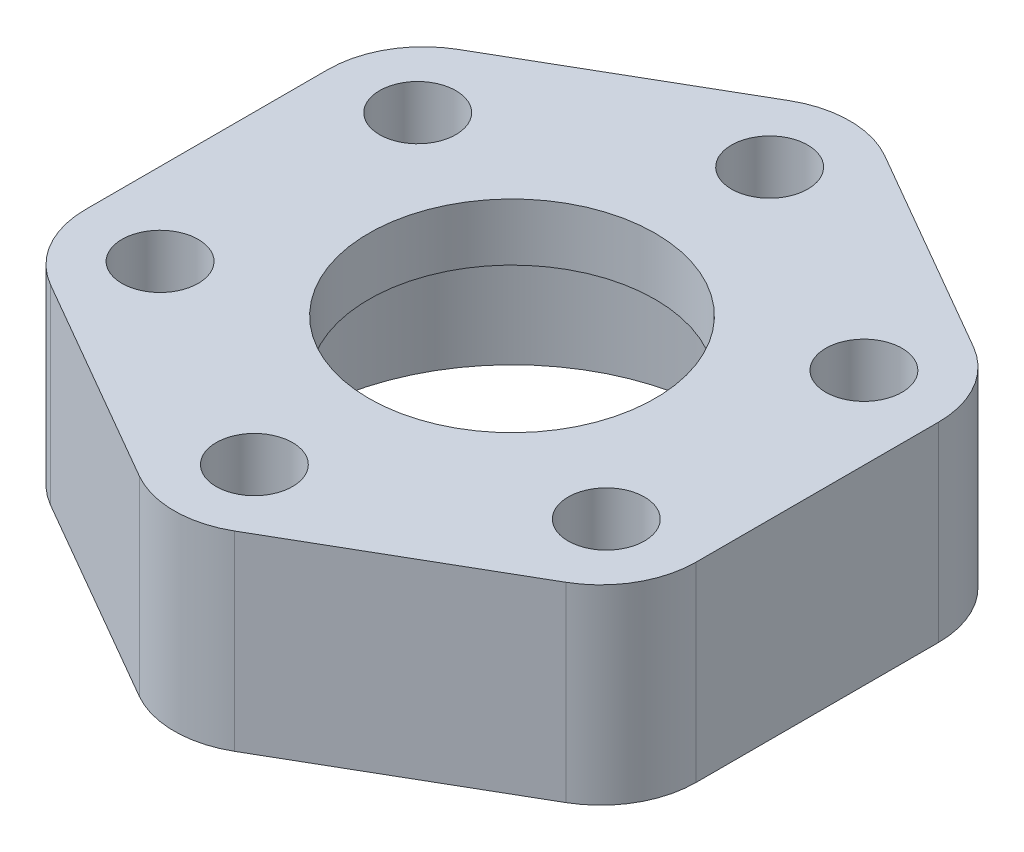
ISO-10303-21;
HEADER;
FILE_DESCRIPTION(('STEP AP214'),'2;1');
FILE_NAME('part.step','',(''),(''),'','','');
FILE_SCHEMA(('AUTOMOTIVE_DESIGN { 1 0 10303 214 1 1 1 1 }'));
ENDSEC;
DATA;
#1=APPLICATION_CONTEXT('core data for automotive mechanical design processes');
#2=APPLICATION_PROTOCOL_DEFINITION('international standard','automotive_design',2000,#1);
#3=PRODUCT_CONTEXT('',#1,'mechanical');
#4=PRODUCT('Part','Part','',(#3));
#5=PRODUCT_RELATED_PRODUCT_CATEGORY('part','',(#4));
#6=PRODUCT_DEFINITION_FORMATION('','',#4);
#7=PRODUCT_DEFINITION_CONTEXT('part definition',#1,'design');
#8=PRODUCT_DEFINITION('design','',#6,#7);
#9=PRODUCT_DEFINITION_SHAPE('','',#8);
#10=(LENGTH_UNIT() NAMED_UNIT(*) SI_UNIT(.MILLI.,.METRE.));
#11=(NAMED_UNIT(*) PLANE_ANGLE_UNIT() SI_UNIT($,.RADIAN.));
#12=(NAMED_UNIT(*) SI_UNIT($,.STERADIAN.) SOLID_ANGLE_UNIT());
#13=UNCERTAINTY_MEASURE_WITH_UNIT(LENGTH_MEASURE(1.E-05),#10,'distance_accuracy_value','');
#14=(GEOMETRIC_REPRESENTATION_CONTEXT(3) GLOBAL_UNCERTAINTY_ASSIGNED_CONTEXT((#13)) GLOBAL_UNIT_ASSIGNED_CONTEXT((#10,
#11,#12)) REPRESENTATION_CONTEXT('',''));
#15=CARTESIAN_POINT('',(0.,0.,0.));
#16=DIRECTION('',(0.,0.,1.));
#17=DIRECTION('',(1.,0.,0.));
#18=AXIS2_PLACEMENT_3D('',#15,#16,#17);
#19=CARTESIAN_POINT('',(0.,10.,0.));
#20=DIRECTION('',(0.,-1.,0.));
#21=DIRECTION('',(0.,0.,-1.));
#22=AXIS2_PLACEMENT_3D('',#19,#20,#21);
#23=CYLINDRICAL_SURFACE('',#22,11.);
#24=CARTESIAN_POINT('',(0.,0.,0.));
#25=DIRECTION('',(0.,1.,0.));
#26=DIRECTION('',(0.,0.,1.));
#27=AXIS2_PLACEMENT_3D('',#24,#25,#26);
#28=CIRCLE('',#27,11.);
#29=CARTESIAN_POINT('',(0.,0.,11.));
#30=VERTEX_POINT('',#29);
#31=EDGE_CURVE('E159',#30,#30,#28,.T.);
#32=ORIENTED_EDGE('',*,*,#31,.F.);
#33=EDGE_LOOP('',(#32));
#34=FACE_BOUND('',#33,.T.);
#35=CARTESIAN_POINT('',(0.,7.,0.));
#36=DIRECTION('',(0.,1.,0.));
#37=DIRECTION('',(0.,0.,1.));
#38=AXIS2_PLACEMENT_3D('',#35,#36,#37);
#39=CIRCLE('',#38,11.);
#40=CARTESIAN_POINT('',(0.,7.,11.));
#41=VERTEX_POINT('',#40);
#42=EDGE_CURVE('E410',#41,#41,#39,.T.);
#43=ORIENTED_EDGE('',*,*,#42,.T.);
#44=EDGE_LOOP('',(#43));
#45=FACE_BOUND('',#44,.T.);
#46=ADVANCED_FACE('F33',(#34,#45),#23,.F.);
#47=CARTESIAN_POINT('',(-11.,10.,-6.35085296108589));
#48=DIRECTION('',(0.,1.,0.));
#49=DIRECTION('',(0.,0.,1.));
#50=AXIS2_PLACEMENT_3D('',#47,#48,#49);
#51=PLANE('',#50);
#52=CARTESIAN_POINT('',(-11.691342951089,10.,6.75000000000056));
#53=DIRECTION('',(0.,1.,0.));
#54=DIRECTION('',(0.,0.,1.));
#55=AXIS2_PLACEMENT_3D('',#52,#53,#54);
#56=CIRCLE('',#55,2.);
#57=CARTESIAN_POINT('',(-11.691342951089,10.,8.75000000000056));
#58=VERTEX_POINT('',#57);
#59=EDGE_CURVE('E422',#58,#58,#56,.T.);
#60=ORIENTED_EDGE('',*,*,#59,.F.);
#61=EDGE_LOOP('',(#60));
#62=FACE_BOUND('',#61,.T.);
#63=CARTESIAN_POINT('',(11.6913429510909,10.,6.74999999999945));
#64=DIRECTION('',(0.,1.,0.));
#65=DIRECTION('',(0.,0.,1.));
#66=AXIS2_PLACEMENT_3D('',#63,#64,#65);
#67=CIRCLE('',#66,2.);
#68=CARTESIAN_POINT('',(11.6913429510909,10.,8.74999999999945));
#69=VERTEX_POINT('',#68);
#70=EDGE_CURVE('E434',#69,#69,#67,.T.);
#71=ORIENTED_EDGE('',*,*,#70,.F.);
#72=EDGE_LOOP('',(#71));
#73=FACE_BOUND('',#72,.T.);
#74=CARTESIAN_POINT('',(0.,10.,-13.5));
#75=DIRECTION('',(0.,1.,0.));
#76=DIRECTION('',(0.,0.,1.));
#77=AXIS2_PLACEMENT_3D('',#74,#75,#76);
#78=CIRCLE('',#77,2.);
#79=CARTESIAN_POINT('',(0.,10.,-11.5));
#80=VERTEX_POINT('',#79);
#81=EDGE_CURVE('E446',#80,#80,#78,.T.);
#82=ORIENTED_EDGE('',*,*,#81,.F.);
#83=EDGE_LOOP('',(#82));
#84=FACE_BOUND('',#83,.T.);
#85=CARTESIAN_POINT('',(-11.,10.,-6.35085296108589));
#86=DIRECTION('',(0.,1.,0.));
#87=DIRECTION('',(0.,0.,1.));
#88=AXIS2_PLACEMENT_3D('',#85,#86,#87);
#89=CIRCLE('',#88,5.);
#90=CARTESIAN_POINT('',(-13.5,10.,-10.6809799800081));
#91=VERTEX_POINT('',#90);
#92=CARTESIAN_POINT('',(-16.,10.,-6.35085296108587));
#93=VERTEX_POINT('',#92);
#94=EDGE_CURVE('E178',#91,#93,#89,.T.);
#95=ORIENTED_EDGE('',*,*,#94,.T.);
#96=DIRECTION('',(0.,0.,1.));
#97=VECTOR('',#96,1.);
#98=CARTESIAN_POINT('',(-16.,10.,-6.35085296108587));
#99=LINE('',#98,#97);
#100=CARTESIAN_POINT('',(-16.,10.,6.35085296108586));
#101=VERTEX_POINT('',#100);
#102=EDGE_CURVE('E105',#93,#101,#99,.T.);
#103=ORIENTED_EDGE('',*,*,#102,.T.);
#104=CARTESIAN_POINT('',(-11.,10.,6.35085296108588));
#105=DIRECTION('',(0.,1.,0.));
#106=DIRECTION('',(0.,0.,1.));
#107=AXIS2_PLACEMENT_3D('',#104,#105,#106);
#108=CIRCLE('',#107,5.);
#109=CARTESIAN_POINT('',(-13.5,10.,10.6809799800081));
#110=VERTEX_POINT('',#109);
#111=EDGE_CURVE('E205',#101,#110,#108,.T.);
#112=ORIENTED_EDGE('',*,*,#111,.T.);
#113=DIRECTION('',(0.866025403784439,0.,0.5));
#114=VECTOR('',#113,1.);
#115=CARTESIAN_POINT('',(-13.5,10.,10.6809799800081));
#116=LINE('',#115,#114);
#117=CARTESIAN_POINT('',(-2.50000000000001,10.,17.0318329410939));
#118=VERTEX_POINT('',#117);
#119=EDGE_CURVE('E224',#110,#118,#116,.T.);
#120=ORIENTED_EDGE('',*,*,#119,.T.);
#121=CARTESIAN_POINT('',(0.,10.,12.7017059221718));
#122=DIRECTION('',(0.,1.,0.));
#123=DIRECTION('',(0.,0.,1.));
#124=AXIS2_PLACEMENT_3D('',#121,#122,#123);
#125=CIRCLE('',#124,5.);
#126=CARTESIAN_POINT('',(2.50000000000003,10.,17.0318329410939));
#127=VERTEX_POINT('',#126);
#128=EDGE_CURVE('E221',#118,#127,#125,.T.);
#129=ORIENTED_EDGE('',*,*,#128,.T.);
#130=DIRECTION('',(0.866025403784439,0.,-0.5));
#131=VECTOR('',#130,1.);
#132=CARTESIAN_POINT('',(2.50000000000003,10.,17.0318329410939));
#133=LINE('',#132,#131);
#134=CARTESIAN_POINT('',(13.5,10.,10.6809799800081));
#135=VERTEX_POINT('',#134);
#136=EDGE_CURVE('E223',#127,#135,#133,.T.);
#137=ORIENTED_EDGE('',*,*,#136,.T.);
#138=CARTESIAN_POINT('',(11.,10.,6.35085296108589));
#139=DIRECTION('',(0.,1.,0.));
#140=DIRECTION('',(0.,0.,1.));
#141=AXIS2_PLACEMENT_3D('',#138,#139,#140);
#142=CIRCLE('',#141,5.);
#143=CARTESIAN_POINT('',(16.,10.,6.35085296108587));
#144=VERTEX_POINT('',#143);
#145=EDGE_CURVE('E226',#135,#144,#142,.T.);
#146=ORIENTED_EDGE('',*,*,#145,.T.);
#147=DIRECTION('',(0.,0.,-1.));
#148=VECTOR('',#147,1.);
#149=CARTESIAN_POINT('',(16.,10.,6.35085296108587));
#150=LINE('',#149,#148);
#151=CARTESIAN_POINT('',(16.,10.,-6.35085296108586));
#152=VERTEX_POINT('',#151);
#153=EDGE_CURVE('E232',#144,#152,#150,.T.);
#154=ORIENTED_EDGE('',*,*,#153,.T.);
#155=CARTESIAN_POINT('',(11.,10.,-6.35085296108588));
#156=DIRECTION('',(0.,1.,0.));
#157=DIRECTION('',(0.,0.,1.));
#158=AXIS2_PLACEMENT_3D('',#155,#156,#157);
#159=CIRCLE('',#158,5.);
#160=CARTESIAN_POINT('',(13.5,10.,-10.6809799800081));
#161=VERTEX_POINT('',#160);
#162=EDGE_CURVE('E137',#152,#161,#159,.T.);
#163=ORIENTED_EDGE('',*,*,#162,.T.);
#164=DIRECTION('',(-0.866025403784439,0.,-0.5));
#165=VECTOR('',#164,1.);
#166=CARTESIAN_POINT('',(13.5,10.,-10.6809799800081));
#167=LINE('',#166,#165);
#168=CARTESIAN_POINT('',(2.50000000000002,10.,-17.0318329410939));
#169=VERTEX_POINT('',#168);
#170=EDGE_CURVE('E130',#161,#169,#167,.T.);
#171=ORIENTED_EDGE('',*,*,#170,.T.);
#172=CARTESIAN_POINT('',(0.,10.,-12.7017059221718));
#173=DIRECTION('',(0.,1.,0.));
#174=DIRECTION('',(0.,0.,-1.));
#175=AXIS2_PLACEMENT_3D('',#172,#173,#174);
#176=CIRCLE('',#175,5.);
#177=CARTESIAN_POINT('',(-2.50000000000002,10.,-17.0318329410939));
#178=VERTEX_POINT('',#177);
#179=EDGE_CURVE('E135',#169,#178,#176,.T.);
#180=ORIENTED_EDGE('',*,*,#179,.T.);
#181=DIRECTION('',(-0.866025403784439,0.,0.499999999999999));
#182=VECTOR('',#181,1.);
#183=CARTESIAN_POINT('',(-2.50000000000002,10.,-17.0318329410939));
#184=LINE('',#183,#182);
#185=EDGE_CURVE('E50',#178,#91,#184,.T.);
#186=ORIENTED_EDGE('',*,*,#185,.T.);
#187=EDGE_LOOP('',(#95,#103,#112,#120,#129,#137,#146,#154,#163,#171,#180,#186));
#188=FACE_BOUND('',#187,.T.);
#189=CARTESIAN_POINT('',(11.6913429510902,10.,-6.75000000000055));
#190=DIRECTION('',(0.,1.,0.));
#191=DIRECTION('',(0.,0.,1.));
#192=AXIS2_PLACEMENT_3D('',#189,#190,#191);
#193=CIRCLE('',#192,2.);
#194=CARTESIAN_POINT('',(11.6913429510902,10.,-4.75000000000055));
#195=VERTEX_POINT('',#194);
#196=EDGE_CURVE('E440',#195,#195,#193,.T.);
#197=ORIENTED_EDGE('',*,*,#196,.F.);
#198=EDGE_LOOP('',(#197));
#199=FACE_BOUND('',#198,.T.);
#200=CARTESIAN_POINT('',(1.27328231675215E-12,10.,13.5));
#201=DIRECTION('',(0.,1.,0.));
#202=DIRECTION('',(0.,0.,1.));
#203=AXIS2_PLACEMENT_3D('',#200,#201,#202);
#204=CIRCLE('',#203,2.);
#205=CARTESIAN_POINT('',(1.27328231675215E-12,10.,15.5));
#206=VERTEX_POINT('',#205);
#207=EDGE_CURVE('E428',#206,#206,#204,.T.);
#208=ORIENTED_EDGE('',*,*,#207,.F.);
#209=EDGE_LOOP('',(#208));
#210=FACE_BOUND('',#209,.T.);
#211=CARTESIAN_POINT('',(-11.6913429510896,10.,-6.74999999999944));
#212=DIRECTION('',(0.,1.,0.));
#213=DIRECTION('',(0.,0.,1.));
#214=AXIS2_PLACEMENT_3D('',#211,#212,#213);
#215=CIRCLE('',#214,2.);
#216=CARTESIAN_POINT('',(-11.6913429510896,10.,-4.74999999999944));
#217=VERTEX_POINT('',#216);
#218=EDGE_CURVE('E416',#217,#217,#215,.T.);
#219=ORIENTED_EDGE('',*,*,#218,.F.);
#220=EDGE_LOOP('',(#219));
#221=FACE_BOUND('',#220,.T.);
#222=CARTESIAN_POINT('',(0.,10.,0.));
#223=DIRECTION('',(0.,1.,0.));
#224=DIRECTION('',(0.,0.,1.));
#225=AXIS2_PLACEMENT_3D('',#222,#223,#224);
#226=CIRCLE('',#225,7.5);
#227=CARTESIAN_POINT('',(0.,10.,7.5));
#228=VERTEX_POINT('',#227);
#229=EDGE_CURVE('E407',#228,#228,#226,.T.);
#230=ORIENTED_EDGE('',*,*,#229,.F.);
#231=EDGE_LOOP('',(#230));
#232=FACE_BOUND('',#231,.T.);
#233=ADVANCED_FACE('F132',(#62,#73,#84,#188,#199,#210,#221,#232),#51,.T.);
#234=CARTESIAN_POINT('',(-11.,0.,-6.35085296108589));
#235=DIRECTION('',(0.,1.,0.));
#236=DIRECTION('',(0.,0.,1.));
#237=AXIS2_PLACEMENT_3D('',#234,#235,#236);
#238=PLANE('',#237);
#239=CARTESIAN_POINT('',(-11.,0.,-6.35085296108589));
#240=DIRECTION('',(0.,1.,0.));
#241=DIRECTION('',(0.,0.,1.));
#242=AXIS2_PLACEMENT_3D('',#239,#240,#241);
#243=CIRCLE('',#242,5.);
#244=CARTESIAN_POINT('',(-13.5,0.,-10.6809799800081));
#245=VERTEX_POINT('',#244);
#246=CARTESIAN_POINT('',(-16.,0.,-6.35085296108587));
#247=VERTEX_POINT('',#246);
#248=EDGE_CURVE('E155',#245,#247,#243,.T.);
#249=ORIENTED_EDGE('',*,*,#248,.F.);
#250=DIRECTION('',(-0.866025403784439,0.,0.499999999999999));
#251=VECTOR('',#250,1.);
#252=CARTESIAN_POINT('',(-2.50000000000002,0.,-17.0318329410939));
#253=LINE('',#252,#251);
#254=CARTESIAN_POINT('',(-2.50000000000002,0.,-17.0318329410939));
#255=VERTEX_POINT('',#254);
#256=EDGE_CURVE('E97',#255,#245,#253,.T.);
#257=ORIENTED_EDGE('',*,*,#256,.F.);
#258=CARTESIAN_POINT('',(0.,0.,-12.7017059221718));
#259=DIRECTION('',(0.,1.,0.));
#260=DIRECTION('',(0.,0.,-1.));
#261=AXIS2_PLACEMENT_3D('',#258,#259,#260);
#262=CIRCLE('',#261,5.);
#263=CARTESIAN_POINT('',(2.50000000000002,0.,-17.0318329410939));
#264=VERTEX_POINT('',#263);
#265=EDGE_CURVE('E91',#264,#255,#262,.T.);
#266=ORIENTED_EDGE('',*,*,#265,.F.);
#267=DIRECTION('',(-0.866025403784439,0.,-0.5));
#268=VECTOR('',#267,1.);
#269=CARTESIAN_POINT('',(13.5,0.,-10.6809799800081));
#270=LINE('',#269,#268);
#271=CARTESIAN_POINT('',(13.5,0.,-10.6809799800081));
#272=VERTEX_POINT('',#271);
#273=EDGE_CURVE('E145',#272,#264,#270,.T.);
#274=ORIENTED_EDGE('',*,*,#273,.F.);
#275=CARTESIAN_POINT('',(11.,0.,-6.35085296108588));
#276=DIRECTION('',(0.,1.,0.));
#277=DIRECTION('',(0.,0.,1.));
#278=AXIS2_PLACEMENT_3D('',#275,#276,#277);
#279=CIRCLE('',#278,5.);
#280=CARTESIAN_POINT('',(16.,0.,-6.35085296108586));
#281=VERTEX_POINT('',#280);
#282=EDGE_CURVE('E173',#281,#272,#279,.T.);
#283=ORIENTED_EDGE('',*,*,#282,.F.);
#284=DIRECTION('',(0.,0.,-1.));
#285=VECTOR('',#284,1.);
#286=CARTESIAN_POINT('',(16.,0.,6.35085296108587));
#287=LINE('',#286,#285);
#288=CARTESIAN_POINT('',(16.,0.,6.35085296108587));
#289=VERTEX_POINT('',#288);
#290=EDGE_CURVE('E171',#289,#281,#287,.T.);
#291=ORIENTED_EDGE('',*,*,#290,.F.);
#292=CARTESIAN_POINT('',(11.,0.,6.35085296108589));
#293=DIRECTION('',(0.,1.,0.));
#294=DIRECTION('',(0.,0.,1.));
#295=AXIS2_PLACEMENT_3D('',#292,#293,#294);
#296=CIRCLE('',#295,5.);
#297=CARTESIAN_POINT('',(13.5,0.,10.6809799800081));
#298=VERTEX_POINT('',#297);
#299=EDGE_CURVE('E169',#298,#289,#296,.T.);
#300=ORIENTED_EDGE('',*,*,#299,.F.);
#301=DIRECTION('',(0.866025403784439,0.,-0.5));
#302=VECTOR('',#301,1.);
#303=CARTESIAN_POINT('',(2.50000000000003,0.,17.0318329410939));
#304=LINE('',#303,#302);
#305=CARTESIAN_POINT('',(2.50000000000003,0.,17.0318329410939));
#306=VERTEX_POINT('',#305);
#307=EDGE_CURVE('E167',#306,#298,#304,.T.);
#308=ORIENTED_EDGE('',*,*,#307,.F.);
#309=CARTESIAN_POINT('',(0.,0.,12.7017059221718));
#310=DIRECTION('',(0.,1.,0.));
#311=DIRECTION('',(0.,0.,1.));
#312=AXIS2_PLACEMENT_3D('',#309,#310,#311);
#313=CIRCLE('',#312,5.);
#314=CARTESIAN_POINT('',(-2.50000000000001,0.,17.0318329410939));
#315=VERTEX_POINT('',#314);
#316=EDGE_CURVE('E165',#315,#306,#313,.T.);
#317=ORIENTED_EDGE('',*,*,#316,.F.);
#318=DIRECTION('',(0.866025403784439,0.,0.5));
#319=VECTOR('',#318,1.);
#320=CARTESIAN_POINT('',(-13.5,0.,10.6809799800081));
#321=LINE('',#320,#319);
#322=CARTESIAN_POINT('',(-13.5,0.,10.6809799800081));
#323=VERTEX_POINT('',#322);
#324=EDGE_CURVE('E163',#323,#315,#321,.T.);
#325=ORIENTED_EDGE('',*,*,#324,.F.);
#326=CARTESIAN_POINT('',(-11.,0.,6.35085296108588));
#327=DIRECTION('',(0.,1.,0.));
#328=DIRECTION('',(0.,0.,1.));
#329=AXIS2_PLACEMENT_3D('',#326,#327,#328);
#330=CIRCLE('',#329,5.);
#331=CARTESIAN_POINT('',(-16.,0.,6.35085296108586));
#332=VERTEX_POINT('',#331);
#333=EDGE_CURVE('E161',#332,#323,#330,.T.);
#334=ORIENTED_EDGE('',*,*,#333,.F.);
#335=DIRECTION('',(0.,0.,1.));
#336=VECTOR('',#335,1.);
#337=CARTESIAN_POINT('',(-16.,0.,-6.35085296108587));
#338=LINE('',#337,#336);
#339=EDGE_CURVE('E158',#247,#332,#338,.T.);
#340=ORIENTED_EDGE('',*,*,#339,.F.);
#341=EDGE_LOOP('',(#249,#257,#266,#274,#283,#291,#300,#308,#317,#325,#334,#340));
#342=FACE_BOUND('',#341,.T.);
#343=ORIENTED_EDGE('',*,*,#31,.T.);
#344=EDGE_LOOP('',(#343));
#345=FACE_BOUND('',#344,.T.);
#346=CARTESIAN_POINT('',(0.,0.,-13.5));
#347=DIRECTION('',(0.,1.,0.));
#348=DIRECTION('',(0.,0.,1.));
#349=AXIS2_PLACEMENT_3D('',#346,#347,#348);
#350=CIRCLE('',#349,2.);
#351=CARTESIAN_POINT('',(0.,0.,-11.5));
#352=VERTEX_POINT('',#351);
#353=EDGE_CURVE('E443',#352,#352,#350,.T.);
#354=ORIENTED_EDGE('',*,*,#353,.T.);
#355=EDGE_LOOP('',(#354));
#356=FACE_BOUND('',#355,.T.);
#357=CARTESIAN_POINT('',(11.6913429510902,0.,-6.75000000000055));
#358=DIRECTION('',(0.,1.,0.));
#359=DIRECTION('',(0.,0.,1.));
#360=AXIS2_PLACEMENT_3D('',#357,#358,#359);
#361=CIRCLE('',#360,2.);
#362=CARTESIAN_POINT('',(11.6913429510902,0.,-4.75000000000055));
#363=VERTEX_POINT('',#362);
#364=EDGE_CURVE('E437',#363,#363,#361,.T.);
#365=ORIENTED_EDGE('',*,*,#364,.T.);
#366=EDGE_LOOP('',(#365));
#367=FACE_BOUND('',#366,.T.);
#368=CARTESIAN_POINT('',(11.6913429510909,0.,6.74999999999945));
#369=DIRECTION('',(0.,1.,0.));
#370=DIRECTION('',(0.,0.,1.));
#371=AXIS2_PLACEMENT_3D('',#368,#369,#370);
#372=CIRCLE('',#371,2.);
#373=CARTESIAN_POINT('',(11.6913429510909,0.,8.74999999999945));
#374=VERTEX_POINT('',#373);
#375=EDGE_CURVE('E431',#374,#374,#372,.T.);
#376=ORIENTED_EDGE('',*,*,#375,.T.);
#377=EDGE_LOOP('',(#376));
#378=FACE_BOUND('',#377,.T.);
#379=CARTESIAN_POINT('',(1.27328231675215E-12,0.,13.5));
#380=DIRECTION('',(0.,1.,0.));
#381=DIRECTION('',(0.,0.,1.));
#382=AXIS2_PLACEMENT_3D('',#379,#380,#381);
#383=CIRCLE('',#382,2.);
#384=CARTESIAN_POINT('',(1.27328231675215E-12,0.,15.5));
#385=VERTEX_POINT('',#384);
#386=EDGE_CURVE('E425',#385,#385,#383,.T.);
#387=ORIENTED_EDGE('',*,*,#386,.T.);
#388=EDGE_LOOP('',(#387));
#389=FACE_BOUND('',#388,.T.);
#390=CARTESIAN_POINT('',(-11.691342951089,0.,6.75000000000056));
#391=DIRECTION('',(0.,1.,0.));
#392=DIRECTION('',(0.,0.,1.));
#393=AXIS2_PLACEMENT_3D('',#390,#391,#392);
#394=CIRCLE('',#393,2.);
#395=CARTESIAN_POINT('',(-11.691342951089,0.,8.75000000000056));
#396=VERTEX_POINT('',#395);
#397=EDGE_CURVE('E419',#396,#396,#394,.T.);
#398=ORIENTED_EDGE('',*,*,#397,.T.);
#399=EDGE_LOOP('',(#398));
#400=FACE_BOUND('',#399,.T.);
#401=CARTESIAN_POINT('',(-11.6913429510896,0.,-6.74999999999944));
#402=DIRECTION('',(0.,1.,0.));
#403=DIRECTION('',(0.,0.,1.));
#404=AXIS2_PLACEMENT_3D('',#401,#402,#403);
#405=CIRCLE('',#404,2.);
#406=CARTESIAN_POINT('',(-11.6913429510896,0.,-4.74999999999944));
#407=VERTEX_POINT('',#406);
#408=EDGE_CURVE('E415',#407,#407,#405,.T.);
#409=ORIENTED_EDGE('',*,*,#408,.T.);
#410=EDGE_LOOP('',(#409));
#411=FACE_BOUND('',#410,.T.);
#412=ADVANCED_FACE('F209',(#342,#345,#356,#367,#378,#389,#400,#411),#238,.F.);
#413=CARTESIAN_POINT('',(-11.,10.,-6.35085296108589));
#414=DIRECTION('',(0.,-1.,0.));
#415=DIRECTION('',(0.,0.,-1.));
#416=AXIS2_PLACEMENT_3D('',#413,#414,#415);
#417=CYLINDRICAL_SURFACE('',#416,5.);
#418=ORIENTED_EDGE('',*,*,#248,.T.);
#419=DIRECTION('',(0.,-1.,0.));
#420=VECTOR('',#419,1.);
#421=CARTESIAN_POINT('',(-16.,10.,-6.35085296108587));
#422=LINE('',#421,#420);
#423=EDGE_CURVE('E11',#93,#247,#422,.T.);
#424=ORIENTED_EDGE('',*,*,#423,.F.);
#425=ORIENTED_EDGE('',*,*,#94,.F.);
#426=DIRECTION('',(0.,-1.,0.));
#427=VECTOR('',#426,1.);
#428=CARTESIAN_POINT('',(-13.5,10.,-10.6809799800081));
#429=LINE('',#428,#427);
#430=EDGE_CURVE('E151',#91,#245,#429,.T.);
#431=ORIENTED_EDGE('',*,*,#430,.T.);
#432=EDGE_LOOP('',(#418,#424,#425,#431));
#433=FACE_BOUND('',#432,.T.);
#434=ADVANCED_FACE('F35',(#433),#417,.T.);
#435=CARTESIAN_POINT('',(-16.,10.,-6.35085296108587));
#436=DIRECTION('',(1.,0.,0.));
#437=DIRECTION('',(0.,0.,-1.));
#438=AXIS2_PLACEMENT_3D('',#435,#436,#437);
#439=PLANE('',#438);
#440=ORIENTED_EDGE('',*,*,#339,.T.);
#441=DIRECTION('',(0.,-1.,0.));
#442=VECTOR('',#441,1.);
#443=CARTESIAN_POINT('',(-16.,10.,6.35085296108586));
#444=LINE('',#443,#442);
#445=EDGE_CURVE('E42',#101,#332,#444,.T.);
#446=ORIENTED_EDGE('',*,*,#445,.F.);
#447=ORIENTED_EDGE('',*,*,#102,.F.);
#448=ORIENTED_EDGE('',*,*,#423,.T.);
#449=EDGE_LOOP('',(#440,#446,#447,#448));
#450=FACE_BOUND('',#449,.T.);
#451=ADVANCED_FACE('F274',(#450),#439,.F.);
#452=CARTESIAN_POINT('',(-11.,10.,6.35085296108588));
#453=DIRECTION('',(0.,-1.,0.));
#454=DIRECTION('',(0.,0.,-1.));
#455=AXIS2_PLACEMENT_3D('',#452,#453,#454);
#456=CYLINDRICAL_SURFACE('',#455,5.);
#457=ORIENTED_EDGE('',*,*,#333,.T.);
#458=DIRECTION('',(0.,-1.,0.));
#459=VECTOR('',#458,1.);
#460=CARTESIAN_POINT('',(-13.5,10.,10.6809799800081));
#461=LINE('',#460,#459);
#462=EDGE_CURVE('E197',#110,#323,#461,.T.);
#463=ORIENTED_EDGE('',*,*,#462,.F.);
#464=ORIENTED_EDGE('',*,*,#111,.F.);
#465=ORIENTED_EDGE('',*,*,#445,.T.);
#466=EDGE_LOOP('',(#457,#463,#464,#465));
#467=FACE_BOUND('',#466,.T.);
#468=ADVANCED_FACE('F203',(#467),#456,.T.);
#469=CARTESIAN_POINT('',(-13.5,10.,10.6809799800081));
#470=DIRECTION('',(0.5,0.,-0.866025403784439));
#471=DIRECTION('',(-0.866025403784439,0.,-0.5));
#472=AXIS2_PLACEMENT_3D('',#469,#470,#471);
#473=PLANE('',#472);
#474=ORIENTED_EDGE('',*,*,#324,.T.);
#475=DIRECTION('',(0.,-1.,0.));
#476=VECTOR('',#475,1.);
#477=CARTESIAN_POINT('',(-2.50000000000001,10.,17.0318329410939));
#478=LINE('',#477,#476);
#479=EDGE_CURVE('E194',#118,#315,#478,.T.);
#480=ORIENTED_EDGE('',*,*,#479,.F.);
#481=ORIENTED_EDGE('',*,*,#119,.F.);
#482=ORIENTED_EDGE('',*,*,#462,.T.);
#483=EDGE_LOOP('',(#474,#480,#481,#482));
#484=FACE_BOUND('',#483,.T.);
#485=ADVANCED_FACE('F215',(#484),#473,.F.);
#486=CARTESIAN_POINT('',(0.,10.,12.7017059221718));
#487=DIRECTION('',(0.,-1.,0.));
#488=DIRECTION('',(0.,0.,-1.));
#489=AXIS2_PLACEMENT_3D('',#486,#487,#488);
#490=CYLINDRICAL_SURFACE('',#489,5.);
#491=ORIENTED_EDGE('',*,*,#316,.T.);
#492=DIRECTION('',(0.,-1.,0.));
#493=VECTOR('',#492,1.);
#494=CARTESIAN_POINT('',(2.50000000000003,10.,17.0318329410939));
#495=LINE('',#494,#493);
#496=EDGE_CURVE('E191',#127,#306,#495,.T.);
#497=ORIENTED_EDGE('',*,*,#496,.F.);
#498=ORIENTED_EDGE('',*,*,#128,.F.);
#499=ORIENTED_EDGE('',*,*,#479,.T.);
#500=EDGE_LOOP('',(#491,#497,#498,#499));
#501=FACE_BOUND('',#500,.T.);
#502=ADVANCED_FACE('F219',(#501),#490,.T.);
#503=CARTESIAN_POINT('',(2.50000000000003,10.,17.0318329410939));
#504=DIRECTION('',(-0.5,0.,-0.866025403784439));
#505=DIRECTION('',(-0.866025403784439,0.,0.5));
#506=AXIS2_PLACEMENT_3D('',#503,#504,#505);
#507=PLANE('',#506);
#508=ORIENTED_EDGE('',*,*,#307,.T.);
#509=DIRECTION('',(0.,-1.,0.));
#510=VECTOR('',#509,1.);
#511=CARTESIAN_POINT('',(13.5,10.,10.6809799800081));
#512=LINE('',#511,#510);
#513=EDGE_CURVE('E188',#135,#298,#512,.T.);
#514=ORIENTED_EDGE('',*,*,#513,.F.);
#515=ORIENTED_EDGE('',*,*,#136,.F.);
#516=ORIENTED_EDGE('',*,*,#496,.T.);
#517=EDGE_LOOP('',(#508,#514,#515,#516));
#518=FACE_BOUND('',#517,.T.);
#519=ADVANCED_FACE('F287',(#518),#507,.F.);
#520=CARTESIAN_POINT('',(11.,10.,6.35085296108589));
#521=DIRECTION('',(0.,-1.,0.));
#522=DIRECTION('',(0.,0.,-1.));
#523=AXIS2_PLACEMENT_3D('',#520,#521,#522);
#524=CYLINDRICAL_SURFACE('',#523,5.);
#525=ORIENTED_EDGE('',*,*,#299,.T.);
#526=DIRECTION('',(0.,-1.,0.));
#527=VECTOR('',#526,1.);
#528=CARTESIAN_POINT('',(16.,10.,6.35085296108587));
#529=LINE('',#528,#527);
#530=EDGE_CURVE('E185',#144,#289,#529,.T.);
#531=ORIENTED_EDGE('',*,*,#530,.F.);
#532=ORIENTED_EDGE('',*,*,#145,.F.);
#533=ORIENTED_EDGE('',*,*,#513,.T.);
#534=EDGE_LOOP('',(#525,#531,#532,#533));
#535=FACE_BOUND('',#534,.T.);
#536=ADVANCED_FACE('F290',(#535),#524,.T.);
#537=CARTESIAN_POINT('',(16.,10.,6.35085296108587));
#538=DIRECTION('',(-1.,0.,0.));
#539=DIRECTION('',(0.,0.,1.));
#540=AXIS2_PLACEMENT_3D('',#537,#538,#539);
#541=PLANE('',#540);
#542=ORIENTED_EDGE('',*,*,#290,.T.);
#543=DIRECTION('',(0.,-1.,0.));
#544=VECTOR('',#543,1.);
#545=CARTESIAN_POINT('',(16.,10.,-6.35085296108586));
#546=LINE('',#545,#544);
#547=EDGE_CURVE('E182',#152,#281,#546,.T.);
#548=ORIENTED_EDGE('',*,*,#547,.F.);
#549=ORIENTED_EDGE('',*,*,#153,.F.);
#550=ORIENTED_EDGE('',*,*,#530,.T.);
#551=EDGE_LOOP('',(#542,#548,#549,#550));
#552=FACE_BOUND('',#551,.T.);
#553=ADVANCED_FACE('F238',(#552),#541,.F.);
#554=CARTESIAN_POINT('',(11.,10.,-6.35085296108588));
#555=DIRECTION('',(0.,-1.,0.));
#556=DIRECTION('',(0.,0.,-1.));
#557=AXIS2_PLACEMENT_3D('',#554,#555,#556);
#558=CYLINDRICAL_SURFACE('',#557,5.);
#559=ORIENTED_EDGE('',*,*,#282,.T.);
#560=DIRECTION('',(0.,-1.,0.));
#561=VECTOR('',#560,1.);
#562=CARTESIAN_POINT('',(13.5,10.,-10.6809799800081));
#563=LINE('',#562,#561);
#564=EDGE_CURVE('E146',#161,#272,#563,.T.);
#565=ORIENTED_EDGE('',*,*,#564,.F.);
#566=ORIENTED_EDGE('',*,*,#162,.F.);
#567=ORIENTED_EDGE('',*,*,#547,.T.);
#568=EDGE_LOOP('',(#559,#565,#566,#567));
#569=FACE_BOUND('',#568,.T.);
#570=ADVANCED_FACE('F242',(#569),#558,.T.);
#571=CARTESIAN_POINT('',(13.5,10.,-10.6809799800081));
#572=DIRECTION('',(-0.5,0.,0.866025403784439));
#573=DIRECTION('',(0.866025403784439,0.,0.5));
#574=AXIS2_PLACEMENT_3D('',#571,#572,#573);
#575=PLANE('',#574);
#576=ORIENTED_EDGE('',*,*,#273,.T.);
#577=DIRECTION('',(0.,-1.,0.));
#578=VECTOR('',#577,1.);
#579=CARTESIAN_POINT('',(2.50000000000002,10.,-17.0318329410939));
#580=LINE('',#579,#578);
#581=EDGE_CURVE('E142',#169,#264,#580,.T.);
#582=ORIENTED_EDGE('',*,*,#581,.F.);
#583=ORIENTED_EDGE('',*,*,#170,.F.);
#584=ORIENTED_EDGE('',*,*,#564,.T.);
#585=EDGE_LOOP('',(#576,#582,#583,#584));
#586=FACE_BOUND('',#585,.T.);
#587=ADVANCED_FACE('F143',(#586),#575,.F.);
#588=CARTESIAN_POINT('',(0.,10.,-12.7017059221718));
#589=DIRECTION('',(0.,-1.,0.));
#590=DIRECTION('',(0.,0.,-1.));
#591=AXIS2_PLACEMENT_3D('',#588,#589,#590);
#592=CYLINDRICAL_SURFACE('',#591,5.);
#593=ORIENTED_EDGE('',*,*,#265,.T.);
#594=DIRECTION('',(0.,-1.,0.));
#595=VECTOR('',#594,1.);
#596=CARTESIAN_POINT('',(-2.50000000000002,10.,-17.0318329410939));
#597=LINE('',#596,#595);
#598=EDGE_CURVE('E147',#178,#255,#597,.T.);
#599=ORIENTED_EDGE('',*,*,#598,.F.);
#600=ORIENTED_EDGE('',*,*,#179,.F.);
#601=ORIENTED_EDGE('',*,*,#581,.T.);
#602=EDGE_LOOP('',(#593,#599,#600,#601));
#603=FACE_BOUND('',#602,.T.);
#604=ADVANCED_FACE('F149',(#603),#592,.T.);
#605=CARTESIAN_POINT('',(-2.50000000000002,10.,-17.0318329410939));
#606=DIRECTION('',(0.5,0.,0.866025403784439));
#607=DIRECTION('',(0.866025403784439,0.,-0.5));
#608=AXIS2_PLACEMENT_3D('',#605,#606,#607);
#609=PLANE('',#608);
#610=ORIENTED_EDGE('',*,*,#256,.T.);
#611=ORIENTED_EDGE('',*,*,#430,.F.);
#612=ORIENTED_EDGE('',*,*,#185,.F.);
#613=ORIENTED_EDGE('',*,*,#598,.T.);
#614=EDGE_LOOP('',(#610,#611,#612,#613));
#615=FACE_BOUND('',#614,.T.);
#616=ADVANCED_FACE('F246',(#615),#609,.F.);
#617=CARTESIAN_POINT('',(0.,10.,-13.5));
#618=DIRECTION('',(0.,-1.,0.));
#619=DIRECTION('',(0.,0.,-1.));
#620=AXIS2_PLACEMENT_3D('',#617,#618,#619);
#621=CYLINDRICAL_SURFACE('',#620,2.);
#622=ORIENTED_EDGE('',*,*,#81,.T.);
#623=EDGE_LOOP('',(#622));
#624=FACE_BOUND('',#623,.T.);
#625=ORIENTED_EDGE('',*,*,#353,.F.);
#626=EDGE_LOOP('',(#625));
#627=FACE_BOUND('',#626,.T.);
#628=ADVANCED_FACE('F248',(#624,#627),#621,.F.);
#629=CARTESIAN_POINT('',(11.6913429510902,10.,-6.75000000000055));
#630=DIRECTION('',(0.,-1.,0.));
#631=DIRECTION('',(0.,0.,-1.));
#632=AXIS2_PLACEMENT_3D('',#629,#630,#631);
#633=CYLINDRICAL_SURFACE('',#632,2.);
#634=ORIENTED_EDGE('',*,*,#196,.T.);
#635=EDGE_LOOP('',(#634));
#636=FACE_BOUND('',#635,.T.);
#637=ORIENTED_EDGE('',*,*,#364,.F.);
#638=EDGE_LOOP('',(#637));
#639=FACE_BOUND('',#638,.T.);
#640=ADVANCED_FACE('F254',(#636,#639),#633,.F.);
#641=CARTESIAN_POINT('',(11.6913429510909,10.,6.74999999999945));
#642=DIRECTION('',(0.,-1.,0.));
#643=DIRECTION('',(0.,0.,-1.));
#644=AXIS2_PLACEMENT_3D('',#641,#642,#643);
#645=CYLINDRICAL_SURFACE('',#644,2.);
#646=ORIENTED_EDGE('',*,*,#70,.T.);
#647=EDGE_LOOP('',(#646));
#648=FACE_BOUND('',#647,.T.);
#649=ORIENTED_EDGE('',*,*,#375,.F.);
#650=EDGE_LOOP('',(#649));
#651=FACE_BOUND('',#650,.T.);
#652=ADVANCED_FACE('F327',(#648,#651),#645,.F.);
#653=CARTESIAN_POINT('',(1.27328231675215E-12,10.,13.5));
#654=DIRECTION('',(0.,-1.,0.));
#655=DIRECTION('',(0.,0.,-1.));
#656=AXIS2_PLACEMENT_3D('',#653,#654,#655);
#657=CYLINDRICAL_SURFACE('',#656,2.);
#658=ORIENTED_EDGE('',*,*,#207,.T.);
#659=EDGE_LOOP('',(#658));
#660=FACE_BOUND('',#659,.T.);
#661=ORIENTED_EDGE('',*,*,#386,.F.);
#662=EDGE_LOOP('',(#661));
#663=FACE_BOUND('',#662,.T.);
#664=ADVANCED_FACE('F336',(#660,#663),#657,.F.);
#665=CARTESIAN_POINT('',(-11.691342951089,10.,6.75000000000056));
#666=DIRECTION('',(0.,-1.,0.));
#667=DIRECTION('',(0.,0.,-1.));
#668=AXIS2_PLACEMENT_3D('',#665,#666,#667);
#669=CYLINDRICAL_SURFACE('',#668,2.);
#670=ORIENTED_EDGE('',*,*,#59,.T.);
#671=EDGE_LOOP('',(#670));
#672=FACE_BOUND('',#671,.T.);
#673=ORIENTED_EDGE('',*,*,#397,.F.);
#674=EDGE_LOOP('',(#673));
#675=FACE_BOUND('',#674,.T.);
#676=ADVANCED_FACE('F346',(#672,#675),#669,.F.);
#677=CARTESIAN_POINT('',(-11.6913429510896,10.,-6.74999999999944));
#678=DIRECTION('',(0.,-1.,0.));
#679=DIRECTION('',(0.,0.,-1.));
#680=AXIS2_PLACEMENT_3D('',#677,#678,#679);
#681=CYLINDRICAL_SURFACE('',#680,2.);
#682=ORIENTED_EDGE('',*,*,#218,.T.);
#683=EDGE_LOOP('',(#682));
#684=FACE_BOUND('',#683,.T.);
#685=ORIENTED_EDGE('',*,*,#408,.F.);
#686=EDGE_LOOP('',(#685));
#687=FACE_BOUND('',#686,.T.);
#688=ADVANCED_FACE('F356',(#684,#687),#681,.F.);
#689=CARTESIAN_POINT('',(0.,7.,0.));
#690=DIRECTION('',(0.,1.,0.));
#691=DIRECTION('',(0.,0.,1.));
#692=AXIS2_PLACEMENT_3D('',#689,#690,#691);
#693=PLANE('',#692);
#694=CARTESIAN_POINT('',(0.,7.,0.));
#695=DIRECTION('',(0.,1.,0.));
#696=DIRECTION('',(0.,0.,1.));
#697=AXIS2_PLACEMENT_3D('',#694,#695,#696);
#698=CIRCLE('',#697,7.5);
#699=CARTESIAN_POINT('',(0.,7.,7.5));
#700=VERTEX_POINT('',#699);
#701=EDGE_CURVE('E404',#700,#700,#698,.T.);
#702=ORIENTED_EDGE('',*,*,#701,.T.);
#703=EDGE_LOOP('',(#702));
#704=FACE_BOUND('',#703,.T.);
#705=ORIENTED_EDGE('',*,*,#42,.F.);
#706=EDGE_LOOP('',(#705));
#707=FACE_BOUND('',#706,.T.);
#708=ADVANCED_FACE('F365',(#704,#707),#693,.F.);
#709=CARTESIAN_POINT('',(0.,7.,0.));
#710=DIRECTION('',(0.,1.,0.));
#711=DIRECTION('',(0.,0.,1.));
#712=AXIS2_PLACEMENT_3D('',#709,#710,#711);
#713=CYLINDRICAL_SURFACE('',#712,7.5);
#714=ORIENTED_EDGE('',*,*,#701,.F.);
#715=EDGE_LOOP('',(#714));
#716=FACE_BOUND('',#715,.T.);
#717=ORIENTED_EDGE('',*,*,#229,.T.);
#718=EDGE_LOOP('',(#717));
#719=FACE_BOUND('',#718,.T.);
#720=ADVANCED_FACE('F387',(#716,#719),#713,.F.);
#721=CLOSED_SHELL('',(#46,#233,#412,#434,#451,#468,#485,#502,#519,#536,#553,#570,#587,#604,#616,
#628,#640,#652,#664,#676,#688,#708,#720));
#722=MANIFOLD_SOLID_BREP('B2',#721);
#723=ADVANCED_BREP_SHAPE_REPRESENTATION('',(#18,#722),#14);
#724=SHAPE_DEFINITION_REPRESENTATION(#9,#723);
ENDSEC;
END-ISO-10303-21;
